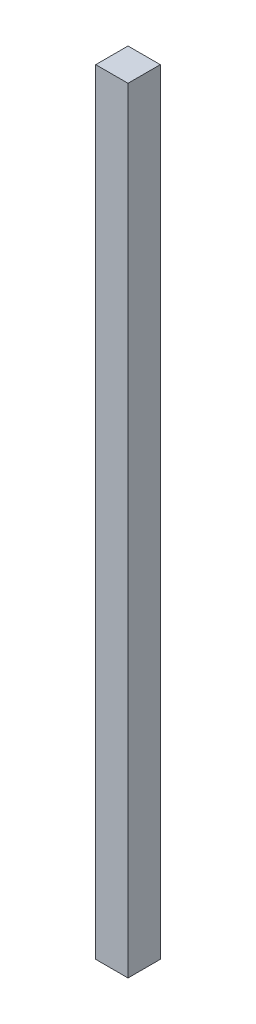
ISO-10303-21;
HEADER;
FILE_DESCRIPTION(('STEP AP214'),'2;1');
FILE_NAME('part.step','',(''),(''),'','','');
FILE_SCHEMA(('AUTOMOTIVE_DESIGN { 1 0 10303 214 1 1 1 1 }'));
ENDSEC;
DATA;
#1=APPLICATION_CONTEXT('core data for automotive mechanical design processes');
#2=APPLICATION_PROTOCOL_DEFINITION('international standard','automotive_design',2000,#1);
#3=PRODUCT_CONTEXT('',#1,'mechanical');
#4=PRODUCT('Part','Part','',(#3));
#5=PRODUCT_RELATED_PRODUCT_CATEGORY('part','',(#4));
#6=PRODUCT_DEFINITION_FORMATION('','',#4);
#7=PRODUCT_DEFINITION_CONTEXT('part definition',#1,'design');
#8=PRODUCT_DEFINITION('design','',#6,#7);
#9=PRODUCT_DEFINITION_SHAPE('','',#8);
#10=(LENGTH_UNIT() NAMED_UNIT(*) SI_UNIT(.MILLI.,.METRE.));
#11=(NAMED_UNIT(*) PLANE_ANGLE_UNIT() SI_UNIT($,.RADIAN.));
#12=(NAMED_UNIT(*) SI_UNIT($,.STERADIAN.) SOLID_ANGLE_UNIT());
#13=UNCERTAINTY_MEASURE_WITH_UNIT(LENGTH_MEASURE(1.E-05),#10,'distance_accuracy_value','');
#14=(GEOMETRIC_REPRESENTATION_CONTEXT(3) GLOBAL_UNCERTAINTY_ASSIGNED_CONTEXT((#13)) GLOBAL_UNIT_ASSIGNED_CONTEXT((#10,
#11,#12)) REPRESENTATION_CONTEXT('',''));
#15=CARTESIAN_POINT('',(0.,0.,0.));
#16=DIRECTION('',(0.,0.,1.));
#17=DIRECTION('',(1.,0.,0.));
#18=AXIS2_PLACEMENT_3D('',#15,#16,#17);
#19=CARTESIAN_POINT('',(0.,609.6,0.));
#20=DIRECTION('',(1.,0.,0.));
#21=DIRECTION('',(0.,0.,-1.));
#22=AXIS2_PLACEMENT_3D('',#19,#20,#21);
#23=PLANE('',#22);
#24=DIRECTION('',(0.,0.,1.));
#25=VECTOR('',#24,1.);
#26=CARTESIAN_POINT('',(0.,0.,0.));
#27=LINE('',#26,#25);
#28=CARTESIAN_POINT('',(0.,0.,-25.4));
#29=VERTEX_POINT('',#28);
#30=CARTESIAN_POINT('',(0.,0.,0.));
#31=VERTEX_POINT('',#30);
#32=EDGE_CURVE('E100',#29,#31,#27,.T.);
#33=ORIENTED_EDGE('',*,*,#32,.T.);
#34=DIRECTION('',(0.,-1.,0.));
#35=VECTOR('',#34,1.);
#36=CARTESIAN_POINT('',(0.,609.6,0.));
#37=LINE('',#36,#35);
#38=CARTESIAN_POINT('',(0.,609.6,0.));
#39=VERTEX_POINT('',#38);
#40=EDGE_CURVE('E11',#39,#31,#37,.T.);
#41=ORIENTED_EDGE('',*,*,#40,.F.);
#42=DIRECTION('',(0.,0.,1.));
#43=VECTOR('',#42,1.);
#44=CARTESIAN_POINT('',(0.,609.6,0.));
#45=LINE('',#44,#43);
#46=CARTESIAN_POINT('',(0.,609.6,-25.4));
#47=VERTEX_POINT('',#46);
#48=EDGE_CURVE('E88',#47,#39,#45,.T.);
#49=ORIENTED_EDGE('',*,*,#48,.F.);
#50=DIRECTION('',(0.,-1.,0.));
#51=VECTOR('',#50,1.);
#52=CARTESIAN_POINT('',(0.,609.6,-25.4));
#53=LINE('',#52,#51);
#54=EDGE_CURVE('E96',#47,#29,#53,.T.);
#55=ORIENTED_EDGE('',*,*,#54,.T.);
#56=EDGE_LOOP('',(#33,#41,#49,#55));
#57=FACE_BOUND('',#56,.T.);
#58=ADVANCED_FACE('F37',(#57),#23,.F.);
#59=CARTESIAN_POINT('',(0.,609.6,0.));
#60=DIRECTION('',(0.,0.,-1.));
#61=DIRECTION('',(-1.,0.,0.));
#62=AXIS2_PLACEMENT_3D('',#59,#60,#61);
#63=PLANE('',#62);
#64=DIRECTION('',(1.,0.,0.));
#65=VECTOR('',#64,1.);
#66=CARTESIAN_POINT('',(0.,0.,0.));
#67=LINE('',#66,#65);
#68=CARTESIAN_POINT('',(25.4,0.,0.));
#69=VERTEX_POINT('',#68);
#70=EDGE_CURVE('E92',#31,#69,#67,.T.);
#71=ORIENTED_EDGE('',*,*,#70,.T.);
#72=DIRECTION('',(0.,-1.,0.));
#73=VECTOR('',#72,1.);
#74=CARTESIAN_POINT('',(25.4,609.6,0.));
#75=LINE('',#74,#73);
#76=CARTESIAN_POINT('',(25.4,609.6,0.));
#77=VERTEX_POINT('',#76);
#78=EDGE_CURVE('E45',#77,#69,#75,.T.);
#79=ORIENTED_EDGE('',*,*,#78,.F.);
#80=DIRECTION('',(1.,0.,0.));
#81=VECTOR('',#80,1.);
#82=CARTESIAN_POINT('',(0.,609.6,0.));
#83=LINE('',#82,#81);
#84=EDGE_CURVE('E83',#39,#77,#83,.T.);
#85=ORIENTED_EDGE('',*,*,#84,.F.);
#86=ORIENTED_EDGE('',*,*,#40,.T.);
#87=EDGE_LOOP('',(#71,#79,#85,#86));
#88=FACE_BOUND('',#87,.T.);
#89=ADVANCED_FACE('F91',(#88),#63,.F.);
#90=CARTESIAN_POINT('',(25.4,609.6,0.));
#91=DIRECTION('',(-1.,0.,0.));
#92=DIRECTION('',(0.,0.,1.));
#93=AXIS2_PLACEMENT_3D('',#90,#91,#92);
#94=PLANE('',#93);
#95=DIRECTION('',(0.,0.,-1.));
#96=VECTOR('',#95,1.);
#97=CARTESIAN_POINT('',(25.4,0.,0.));
#98=LINE('',#97,#96);
#99=CARTESIAN_POINT('',(25.4,0.,-25.4));
#100=VERTEX_POINT('',#99);
#101=EDGE_CURVE('E70',#69,#100,#98,.T.);
#102=ORIENTED_EDGE('',*,*,#101,.T.);
#103=DIRECTION('',(0.,-1.,0.));
#104=VECTOR('',#103,1.);
#105=CARTESIAN_POINT('',(25.4,609.6,-25.4));
#106=LINE('',#105,#104);
#107=CARTESIAN_POINT('',(25.4,609.6,-25.4));
#108=VERTEX_POINT('',#107);
#109=EDGE_CURVE('E93',#108,#100,#106,.T.);
#110=ORIENTED_EDGE('',*,*,#109,.F.);
#111=DIRECTION('',(0.,0.,-1.));
#112=VECTOR('',#111,1.);
#113=CARTESIAN_POINT('',(25.4,609.6,0.));
#114=LINE('',#113,#112);
#115=EDGE_CURVE('E86',#77,#108,#114,.T.);
#116=ORIENTED_EDGE('',*,*,#115,.F.);
#117=ORIENTED_EDGE('',*,*,#78,.T.);
#118=EDGE_LOOP('',(#102,#110,#116,#117));
#119=FACE_BOUND('',#118,.T.);
#120=ADVANCED_FACE('F94',(#119),#94,.F.);
#121=CARTESIAN_POINT('',(0.,609.6,-25.4));
#122=DIRECTION('',(0.,0.,1.));
#123=DIRECTION('',(1.,0.,0.));
#124=AXIS2_PLACEMENT_3D('',#121,#122,#123);
#125=PLANE('',#124);
#126=DIRECTION('',(-1.,0.,0.));
#127=VECTOR('',#126,1.);
#128=CARTESIAN_POINT('',(0.,0.,-25.4));
#129=LINE('',#128,#127);
#130=EDGE_CURVE('E76',#100,#29,#129,.T.);
#131=ORIENTED_EDGE('',*,*,#130,.T.);
#132=ORIENTED_EDGE('',*,*,#54,.F.);
#133=DIRECTION('',(-1.,0.,0.));
#134=VECTOR('',#133,1.);
#135=CARTESIAN_POINT('',(0.,609.6,-25.4));
#136=LINE('',#135,#134);
#137=EDGE_CURVE('E53',#108,#47,#136,.T.);
#138=ORIENTED_EDGE('',*,*,#137,.F.);
#139=ORIENTED_EDGE('',*,*,#109,.T.);
#140=EDGE_LOOP('',(#131,#132,#138,#139));
#141=FACE_BOUND('',#140,.T.);
#142=ADVANCED_FACE('F107',(#141),#125,.F.);
#143=CARTESIAN_POINT('',(0.,609.6,0.));
#144=DIRECTION('',(0.,-1.,0.));
#145=DIRECTION('',(0.,0.,-1.));
#146=AXIS2_PLACEMENT_3D('',#143,#144,#145);
#147=PLANE('',#146);
#148=ORIENTED_EDGE('',*,*,#48,.T.);
#149=ORIENTED_EDGE('',*,*,#84,.T.);
#150=ORIENTED_EDGE('',*,*,#115,.T.);
#151=ORIENTED_EDGE('',*,*,#137,.T.);
#152=EDGE_LOOP('',(#148,#149,#150,#151));
#153=FACE_BOUND('',#152,.T.);
#154=ADVANCED_FACE('F84',(#153),#147,.F.);
#155=CARTESIAN_POINT('',(0.,0.,0.));
#156=DIRECTION('',(0.,-1.,0.));
#157=DIRECTION('',(0.,0.,-1.));
#158=AXIS2_PLACEMENT_3D('',#155,#156,#157);
#159=PLANE('',#158);
#160=ORIENTED_EDGE('',*,*,#32,.F.);
#161=ORIENTED_EDGE('',*,*,#130,.F.);
#162=ORIENTED_EDGE('',*,*,#101,.F.);
#163=ORIENTED_EDGE('',*,*,#70,.F.);
#164=EDGE_LOOP('',(#160,#161,#162,#163));
#165=FACE_BOUND('',#164,.T.);
#166=ADVANCED_FACE('F110',(#165),#159,.T.);
#167=CLOSED_SHELL('',(#58,#89,#120,#142,#154,#166));
#168=MANIFOLD_SOLID_BREP('B2',#167);
#169=ADVANCED_BREP_SHAPE_REPRESENTATION('',(#18,#168),#14);
#170=SHAPE_DEFINITION_REPRESENTATION(#9,#169);
ENDSEC;
END-ISO-10303-21;
